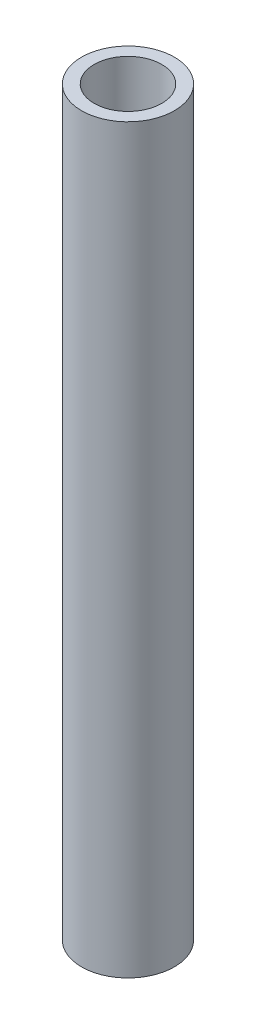
ISO-10303-21;
HEADER;
FILE_DESCRIPTION(('STEP AP214'),'2;1');
FILE_NAME('part.step','',(''),(''),'','','');
FILE_SCHEMA(('AUTOMOTIVE_DESIGN { 1 0 10303 214 1 1 1 1 }'));
ENDSEC;
DATA;
#1=APPLICATION_CONTEXT('core data for automotive mechanical design processes');
#2=APPLICATION_PROTOCOL_DEFINITION('international standard','automotive_design',2000,#1);
#3=PRODUCT_CONTEXT('',#1,'mechanical');
#4=PRODUCT('Part','Part','',(#3));
#5=PRODUCT_RELATED_PRODUCT_CATEGORY('part','',(#4));
#6=PRODUCT_DEFINITION_FORMATION('','',#4);
#7=PRODUCT_DEFINITION_CONTEXT('part definition',#1,'design');
#8=PRODUCT_DEFINITION('design','',#6,#7);
#9=PRODUCT_DEFINITION_SHAPE('','',#8);
#10=(LENGTH_UNIT() NAMED_UNIT(*) SI_UNIT(.MILLI.,.METRE.));
#11=(NAMED_UNIT(*) PLANE_ANGLE_UNIT() SI_UNIT($,.RADIAN.));
#12=(NAMED_UNIT(*) SI_UNIT($,.STERADIAN.) SOLID_ANGLE_UNIT());
#13=UNCERTAINTY_MEASURE_WITH_UNIT(LENGTH_MEASURE(1.E-05),#10,'distance_accuracy_value','');
#14=(GEOMETRIC_REPRESENTATION_CONTEXT(3) GLOBAL_UNCERTAINTY_ASSIGNED_CONTEXT((#13)) GLOBAL_UNIT_ASSIGNED_CONTEXT((#10,
#11,#12)) REPRESENTATION_CONTEXT('',''));
#15=CARTESIAN_POINT('',(0.,0.,0.));
#16=DIRECTION('',(0.,0.,1.));
#17=DIRECTION('',(1.,0.,0.));
#18=AXIS2_PLACEMENT_3D('',#15,#16,#17);
#19=CARTESIAN_POINT('',(0.,266.7,0.));
#20=DIRECTION('',(0.,1.,0.));
#21=DIRECTION('',(0.,0.,1.));
#22=AXIS2_PLACEMENT_3D('',#19,#20,#21);
#23=PLANE('',#22);
#24=CARTESIAN_POINT('',(0.,266.7,0.));
#25=DIRECTION('',(0.,1.,0.));
#26=DIRECTION('',(0.,0.,1.));
#27=AXIS2_PLACEMENT_3D('',#24,#25,#26);
#28=CIRCLE('',#27,33.401);
#29=CARTESIAN_POINT('',(0.,266.7,33.401));
#30=VERTEX_POINT('',#29);
#31=EDGE_CURVE('E10',#30,#30,#28,.T.);
#32=ORIENTED_EDGE('',*,*,#31,.T.);
#33=EDGE_LOOP('',(#32));
#34=FACE_BOUND('',#33,.T.);
#35=CARTESIAN_POINT('',(0.,266.7,0.));
#36=DIRECTION('',(0.,1.,0.));
#37=DIRECTION('',(0.,0.,1.));
#38=AXIS2_PLACEMENT_3D('',#35,#36,#37);
#39=CIRCLE('',#38,24.3078);
#40=CARTESIAN_POINT('',(0.,266.7,24.3078));
#41=VERTEX_POINT('',#40);
#42=EDGE_CURVE('E42',#41,#41,#39,.T.);
#43=ORIENTED_EDGE('',*,*,#42,.F.);
#44=EDGE_LOOP('',(#43));
#45=FACE_BOUND('',#44,.T.);
#46=ADVANCED_FACE('F31',(#34,#45),#23,.T.);
#47=CARTESIAN_POINT('',(0.,-266.7,0.));
#48=DIRECTION('',(0.,1.,0.));
#49=DIRECTION('',(0.,0.,1.));
#50=AXIS2_PLACEMENT_3D('',#47,#48,#49);
#51=PLANE('',#50);
#52=CARTESIAN_POINT('',(0.,-266.7,0.));
#53=DIRECTION('',(0.,1.,0.));
#54=DIRECTION('',(0.,0.,1.));
#55=AXIS2_PLACEMENT_3D('',#52,#53,#54);
#56=CIRCLE('',#55,33.401);
#57=CARTESIAN_POINT('',(0.,-266.7,33.401));
#58=VERTEX_POINT('',#57);
#59=EDGE_CURVE('E35',#58,#58,#56,.T.);
#60=ORIENTED_EDGE('',*,*,#59,.F.);
#61=EDGE_LOOP('',(#60));
#62=FACE_BOUND('',#61,.T.);
#63=CARTESIAN_POINT('',(0.,-266.7,0.));
#64=DIRECTION('',(0.,1.,0.));
#65=DIRECTION('',(0.,0.,1.));
#66=AXIS2_PLACEMENT_3D('',#63,#64,#65);
#67=CIRCLE('',#66,24.3078);
#68=CARTESIAN_POINT('',(0.,-266.7,24.3078));
#69=VERTEX_POINT('',#68);
#70=EDGE_CURVE('E44',#69,#69,#67,.T.);
#71=ORIENTED_EDGE('',*,*,#70,.T.);
#72=EDGE_LOOP('',(#71));
#73=FACE_BOUND('',#72,.T.);
#74=ADVANCED_FACE('F54',(#62,#73),#51,.F.);
#75=CARTESIAN_POINT('',(0.,266.7,0.));
#76=DIRECTION('',(0.,-1.,0.));
#77=DIRECTION('',(0.,0.,-1.));
#78=AXIS2_PLACEMENT_3D('',#75,#76,#77);
#79=CYLINDRICAL_SURFACE('',#78,33.401);
#80=ORIENTED_EDGE('',*,*,#31,.F.);
#81=EDGE_LOOP('',(#80));
#82=FACE_BOUND('',#81,.T.);
#83=ORIENTED_EDGE('',*,*,#59,.T.);
#84=EDGE_LOOP('',(#83));
#85=FACE_BOUND('',#84,.T.);
#86=ADVANCED_FACE('F33',(#82,#85),#79,.T.);
#87=CARTESIAN_POINT('',(0.,266.7,0.));
#88=DIRECTION('',(0.,-1.,0.));
#89=DIRECTION('',(0.,0.,-1.));
#90=AXIS2_PLACEMENT_3D('',#87,#88,#89);
#91=CYLINDRICAL_SURFACE('',#90,24.3078);
#92=ORIENTED_EDGE('',*,*,#42,.T.);
#93=EDGE_LOOP('',(#92));
#94=FACE_BOUND('',#93,.T.);
#95=ORIENTED_EDGE('',*,*,#70,.F.);
#96=EDGE_LOOP('',(#95));
#97=FACE_BOUND('',#96,.T.);
#98=ADVANCED_FACE('F50',(#94,#97),#91,.F.);
#99=CLOSED_SHELL('',(#46,#74,#86,#98));
#100=MANIFOLD_SOLID_BREP('B2',#99);
#101=ADVANCED_BREP_SHAPE_REPRESENTATION('',(#18,#100),#14);
#102=SHAPE_DEFINITION_REPRESENTATION(#9,#101);
ENDSEC;
END-ISO-10303-21;
